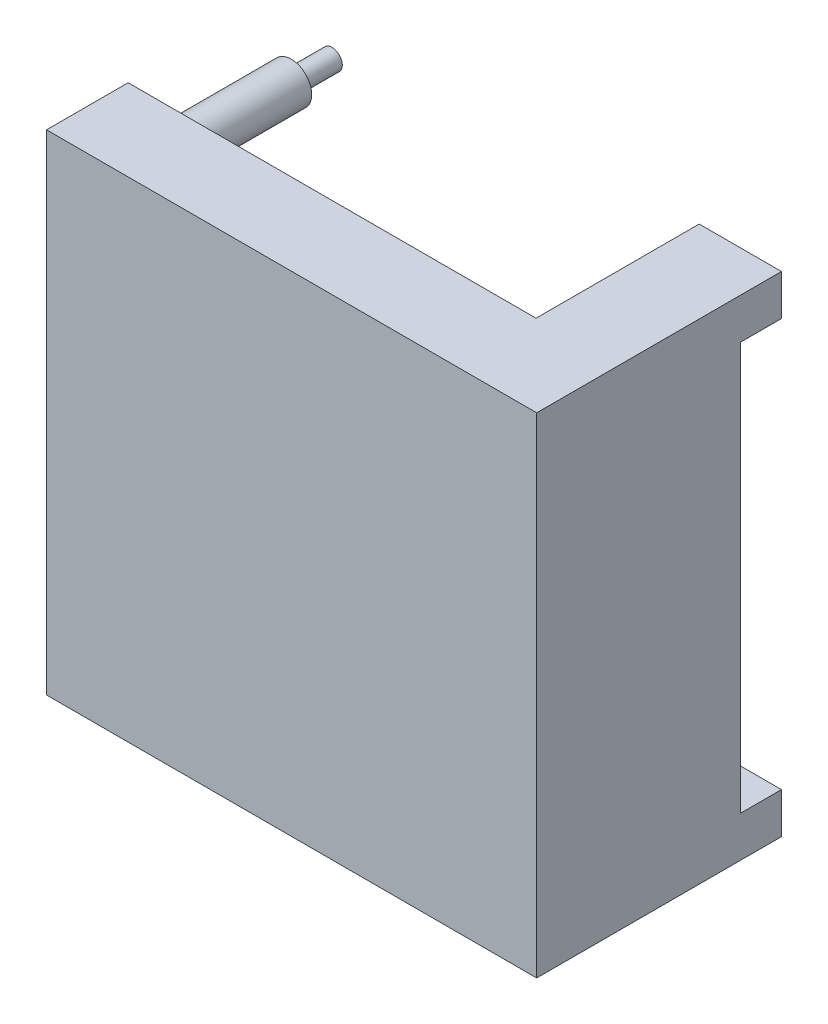
ISO-10303-21;
HEADER;
FILE_DESCRIPTION(('STEP AP214'),'2;1');
FILE_NAME('part.step','',(''),(''),'','','');
FILE_SCHEMA(('AUTOMOTIVE_DESIGN { 1 0 10303 214 1 1 1 1 }'));
ENDSEC;
DATA;
#1=APPLICATION_CONTEXT('core data for automotive mechanical design processes');
#2=APPLICATION_PROTOCOL_DEFINITION('international standard','automotive_design',2000,#1);
#3=PRODUCT_CONTEXT('',#1,'mechanical');
#4=PRODUCT('Part','Part','',(#3));
#5=PRODUCT_RELATED_PRODUCT_CATEGORY('part','',(#4));
#6=PRODUCT_DEFINITION_FORMATION('','',#4);
#7=PRODUCT_DEFINITION_CONTEXT('part definition',#1,'design');
#8=PRODUCT_DEFINITION('design','',#6,#7);
#9=PRODUCT_DEFINITION_SHAPE('','',#8);
#10=(LENGTH_UNIT() NAMED_UNIT(*) SI_UNIT(.MILLI.,.METRE.));
#11=(NAMED_UNIT(*) PLANE_ANGLE_UNIT() SI_UNIT($,.RADIAN.));
#12=(NAMED_UNIT(*) SI_UNIT($,.STERADIAN.) SOLID_ANGLE_UNIT());
#13=UNCERTAINTY_MEASURE_WITH_UNIT(LENGTH_MEASURE(1.E-05),#10,'distance_accuracy_value','');
#14=(GEOMETRIC_REPRESENTATION_CONTEXT(3) GLOBAL_UNCERTAINTY_ASSIGNED_CONTEXT((#13)) GLOBAL_UNIT_ASSIGNED_CONTEXT((#10,
#11,#12)) REPRESENTATION_CONTEXT('',''));
#15=CARTESIAN_POINT('',(0.,0.,0.));
#16=DIRECTION('',(0.,0.,1.));
#17=DIRECTION('',(1.,0.,0.));
#18=AXIS2_PLACEMENT_3D('',#15,#16,#17);
#19=CARTESIAN_POINT('',(120.162650783324,60.,-60.));
#20=DIRECTION('',(0.,0.,1.));
#21=DIRECTION('',(1.,0.,0.));
#22=AXIS2_PLACEMENT_3D('',#19,#20,#21);
#23=PLANE('',#22);
#24=DIRECTION('',(0.,-1.,0.));
#25=VECTOR('',#24,1.);
#26=CARTESIAN_POINT('',(100.,60.,-60.));
#27=LINE('',#26,#25);
#28=CARTESIAN_POINT('',(100.,-20.,-60.));
#29=VERTEX_POINT('',#28);
#30=CARTESIAN_POINT('',(100.,-30.,-60.));
#31=VERTEX_POINT('',#30);
#32=EDGE_CURVE('E209',#29,#31,#27,.T.);
#33=ORIENTED_EDGE('',*,*,#32,.F.);
#34=DIRECTION('',(-1.,0.,0.));
#35=VECTOR('',#34,1.);
#36=CARTESIAN_POINT('',(100.,-20.,-60.));
#37=LINE('',#36,#35);
#38=CARTESIAN_POINT('',(120.162650783324,-20.,-60.));
#39=VERTEX_POINT('',#38);
#40=EDGE_CURVE('E140',#39,#29,#37,.T.);
#41=ORIENTED_EDGE('',*,*,#40,.F.);
#42=DIRECTION('',(0.,-1.,0.));
#43=VECTOR('',#42,1.);
#44=CARTESIAN_POINT('',(120.162650783324,60.,-60.));
#45=LINE('',#44,#43);
#46=CARTESIAN_POINT('',(120.162650783324,-30.,-60.));
#47=VERTEX_POINT('',#46);
#48=EDGE_CURVE('E145',#39,#47,#45,.T.);
#49=ORIENTED_EDGE('',*,*,#48,.T.);
#50=DIRECTION('',(1.,0.,0.));
#51=VECTOR('',#50,1.);
#52=CARTESIAN_POINT('',(120.162650783324,-30.,-60.));
#53=LINE('',#52,#51);
#54=EDGE_CURVE('E180',#31,#47,#53,.T.);
#55=ORIENTED_EDGE('',*,*,#54,.F.);
#56=EDGE_LOOP('',(#33,#41,#49,#55));
#57=FACE_BOUND('',#56,.T.);
#58=ADVANCED_FACE('F38',(#57),#23,.F.);
#59=CARTESIAN_POINT('',(0.,60.,-20.));
#60=DIRECTION('',(1.,0.,0.));
#61=DIRECTION('',(0.,0.,-1.));
#62=AXIS2_PLACEMENT_3D('',#59,#60,#61);
#63=PLANE('',#62);
#64=DIRECTION('',(0.,-1.,0.));
#65=VECTOR('',#64,1.);
#66=CARTESIAN_POINT('',(0.,60.,-20.));
#67=LINE('',#66,#65);
#68=CARTESIAN_POINT('',(0.,90.,-20.));
#69=VERTEX_POINT('',#68);
#70=CARTESIAN_POINT('',(0.,-30.,-20.));
#71=VERTEX_POINT('',#70);
#72=EDGE_CURVE('E130',#69,#71,#67,.T.);
#73=ORIENTED_EDGE('',*,*,#72,.T.);
#74=DIRECTION('',(0.,0.,-1.));
#75=VECTOR('',#74,1.);
#76=CARTESIAN_POINT('',(0.,-30.,-20.));
#77=LINE('',#76,#75);
#78=CARTESIAN_POINT('',(0.,-30.,0.));
#79=VERTEX_POINT('',#78);
#80=EDGE_CURVE('E189',#79,#71,#77,.T.);
#81=ORIENTED_EDGE('',*,*,#80,.F.);
#82=DIRECTION('',(0.,-1.,0.));
#83=VECTOR('',#82,1.);
#84=CARTESIAN_POINT('',(0.,60.,0.));
#85=LINE('',#84,#83);
#86=CARTESIAN_POINT('',(0.,90.,0.));
#87=VERTEX_POINT('',#86);
#88=EDGE_CURVE('E216',#87,#79,#85,.T.);
#89=ORIENTED_EDGE('',*,*,#88,.F.);
#90=DIRECTION('',(0.,0.,1.));
#91=VECTOR('',#90,1.);
#92=CARTESIAN_POINT('',(0.,90.,-20.));
#93=LINE('',#92,#91);
#94=EDGE_CURVE('E195',#69,#87,#93,.T.);
#95=ORIENTED_EDGE('',*,*,#94,.F.);
#96=EDGE_LOOP('',(#73,#81,#89,#95));
#97=FACE_BOUND('',#96,.T.);
#98=ADVANCED_FACE('F40',(#97),#63,.F.);
#99=CARTESIAN_POINT('',(0.,60.,0.));
#100=DIRECTION('',(0.,0.,-1.));
#101=DIRECTION('',(-1.,0.,0.));
#102=AXIS2_PLACEMENT_3D('',#99,#100,#101);
#103=PLANE('',#102);
#104=ORIENTED_EDGE('',*,*,#88,.T.);
#105=DIRECTION('',(-1.,0.,0.));
#106=VECTOR('',#105,1.);
#107=CARTESIAN_POINT('',(0.,-30.,0.));
#108=LINE('',#107,#106);
#109=CARTESIAN_POINT('',(120.162650783324,-30.,0.));
#110=VERTEX_POINT('',#109);
#111=EDGE_CURVE('E186',#110,#79,#108,.T.);
#112=ORIENTED_EDGE('',*,*,#111,.F.);
#113=DIRECTION('',(0.,-1.,0.));
#114=VECTOR('',#113,1.);
#115=CARTESIAN_POINT('',(120.162650783324,60.,0.));
#116=LINE('',#115,#114);
#117=CARTESIAN_POINT('',(120.162650783324,90.,0.));
#118=VERTEX_POINT('',#117);
#119=EDGE_CURVE('E214',#118,#110,#116,.T.);
#120=ORIENTED_EDGE('',*,*,#119,.F.);
#121=DIRECTION('',(1.,0.,0.));
#122=VECTOR('',#121,1.);
#123=CARTESIAN_POINT('',(0.,90.,0.));
#124=LINE('',#123,#122);
#125=EDGE_CURVE('E198',#87,#118,#124,.T.);
#126=ORIENTED_EDGE('',*,*,#125,.F.);
#127=EDGE_LOOP('',(#104,#112,#120,#126));
#128=FACE_BOUND('',#127,.T.);
#129=ADVANCED_FACE('F249',(#128),#103,.F.);
#130=CARTESIAN_POINT('',(120.162650783324,60.,0.));
#131=DIRECTION('',(-1.,0.,0.));
#132=DIRECTION('',(0.,0.,1.));
#133=AXIS2_PLACEMENT_3D('',#130,#131,#132);
#134=PLANE('',#133);
#135=ORIENTED_EDGE('',*,*,#48,.F.);
#136=DIRECTION('',(0.,0.,-1.));
#137=VECTOR('',#136,1.);
#138=CARTESIAN_POINT('',(120.162650783324,-20.,-50.));
#139=LINE('',#138,#137);
#140=CARTESIAN_POINT('',(120.162650783324,-20.,-50.));
#141=VERTEX_POINT('',#140);
#142=EDGE_CURVE('E136',#141,#39,#139,.T.);
#143=ORIENTED_EDGE('',*,*,#142,.F.);
#144=DIRECTION('',(0.,-1.,0.));
#145=VECTOR('',#144,1.);
#146=CARTESIAN_POINT('',(120.162650783324,10.,-50.));
#147=LINE('',#146,#145);
#148=CARTESIAN_POINT('',(120.162650783324,80.,-50.));
#149=VERTEX_POINT('',#148);
#150=EDGE_CURVE('E120',#149,#141,#147,.T.);
#151=ORIENTED_EDGE('',*,*,#150,.F.);
#152=DIRECTION('',(0.,0.,-1.));
#153=VECTOR('',#152,1.);
#154=CARTESIAN_POINT('',(120.162650783324,80.,-50.));
#155=LINE('',#154,#153);
#156=CARTESIAN_POINT('',(120.162650783324,80.,-60.));
#157=VERTEX_POINT('',#156);
#158=EDGE_CURVE('E153',#149,#157,#155,.T.);
#159=ORIENTED_EDGE('',*,*,#158,.T.);
#160=CARTESIAN_POINT('',(120.162650783324,90.,-60.));
#161=VERTEX_POINT('',#160);
#162=EDGE_CURVE('E211',#161,#157,#45,.T.);
#163=ORIENTED_EDGE('',*,*,#162,.F.);
#164=DIRECTION('',(0.,0.,-1.));
#165=VECTOR('',#164,1.);
#166=CARTESIAN_POINT('',(120.162650783324,90.,0.));
#167=LINE('',#166,#165);
#168=EDGE_CURVE('E201',#118,#161,#167,.T.);
#169=ORIENTED_EDGE('',*,*,#168,.F.);
#170=ORIENTED_EDGE('',*,*,#119,.T.);
#171=DIRECTION('',(0.,0.,1.));
#172=VECTOR('',#171,1.);
#173=CARTESIAN_POINT('',(120.162650783324,-30.,0.));
#174=LINE('',#173,#172);
#175=EDGE_CURVE('E183',#47,#110,#174,.T.);
#176=ORIENTED_EDGE('',*,*,#175,.F.);
#177=EDGE_LOOP('',(#135,#143,#151,#159,#163,#169,#170,#176));
#178=FACE_BOUND('',#177,.T.);
#179=ADVANCED_FACE('F143',(#178),#134,.F.);
#180=ORIENTED_EDGE('',*,*,#162,.T.);
#181=DIRECTION('',(1.,0.,0.));
#182=VECTOR('',#181,1.);
#183=CARTESIAN_POINT('',(100.,80.,-60.));
#184=LINE('',#183,#182);
#185=CARTESIAN_POINT('',(100.,80.,-60.));
#186=VERTEX_POINT('',#185);
#187=EDGE_CURVE('E155',#186,#157,#184,.T.);
#188=ORIENTED_EDGE('',*,*,#187,.F.);
#189=CARTESIAN_POINT('',(100.,90.,-60.));
#190=VERTEX_POINT('',#189);
#191=EDGE_CURVE('E63',#190,#186,#27,.T.);
#192=ORIENTED_EDGE('',*,*,#191,.F.);
#193=DIRECTION('',(-1.,0.,0.));
#194=VECTOR('',#193,1.);
#195=CARTESIAN_POINT('',(120.162650783324,90.,-60.));
#196=LINE('',#195,#194);
#197=EDGE_CURVE('E204',#161,#190,#196,.T.);
#198=ORIENTED_EDGE('',*,*,#197,.F.);
#199=EDGE_LOOP('',(#180,#188,#192,#198));
#200=FACE_BOUND('',#199,.T.);
#201=ADVANCED_FACE('F246',(#200),#23,.F.);
#202=CARTESIAN_POINT('',(100.,60.,-60.));
#203=DIRECTION('',(1.,0.,0.));
#204=DIRECTION('',(0.,0.,-1.));
#205=AXIS2_PLACEMENT_3D('',#202,#203,#204);
#206=PLANE('',#205);
#207=DIRECTION('',(0.,-1.,0.));
#208=VECTOR('',#207,1.);
#209=CARTESIAN_POINT('',(100.,60.,-50.));
#210=LINE('',#209,#208);
#211=CARTESIAN_POINT('',(100.,80.,-50.));
#212=VERTEX_POINT('',#211);
#213=CARTESIAN_POINT('',(100.,-20.,-50.));
#214=VERTEX_POINT('',#213);
#215=EDGE_CURVE('E217',#212,#214,#210,.T.);
#216=ORIENTED_EDGE('',*,*,#215,.T.);
#217=DIRECTION('',(0.,0.,-1.));
#218=VECTOR('',#217,1.);
#219=CARTESIAN_POINT('',(100.,-20.,-50.));
#220=LINE('',#219,#218);
#221=EDGE_CURVE('E139',#214,#29,#220,.T.);
#222=ORIENTED_EDGE('',*,*,#221,.T.);
#223=ORIENTED_EDGE('',*,*,#32,.T.);
#224=DIRECTION('',(0.,0.,-1.));
#225=VECTOR('',#224,1.);
#226=CARTESIAN_POINT('',(100.,-30.,-60.));
#227=LINE('',#226,#225);
#228=CARTESIAN_POINT('',(100.,-30.,-20.));
#229=VERTEX_POINT('',#228);
#230=EDGE_CURVE('E177',#229,#31,#227,.T.);
#231=ORIENTED_EDGE('',*,*,#230,.F.);
#232=DIRECTION('',(0.,-1.,0.));
#233=VECTOR('',#232,1.);
#234=CARTESIAN_POINT('',(100.,60.,-20.));
#235=LINE('',#234,#233);
#236=CARTESIAN_POINT('',(100.,90.,-20.));
#237=VERTEX_POINT('',#236);
#238=EDGE_CURVE('E55',#237,#229,#235,.T.);
#239=ORIENTED_EDGE('',*,*,#238,.F.);
#240=DIRECTION('',(0.,0.,1.));
#241=VECTOR('',#240,1.);
#242=CARTESIAN_POINT('',(100.,90.,-60.));
#243=LINE('',#242,#241);
#244=EDGE_CURVE('E131',#190,#237,#243,.T.);
#245=ORIENTED_EDGE('',*,*,#244,.F.);
#246=ORIENTED_EDGE('',*,*,#191,.T.);
#247=DIRECTION('',(0.,0.,-1.));
#248=VECTOR('',#247,1.);
#249=CARTESIAN_POINT('',(100.,80.,-50.));
#250=LINE('',#249,#248);
#251=EDGE_CURVE('E151',#212,#186,#250,.T.);
#252=ORIENTED_EDGE('',*,*,#251,.F.);
#253=EDGE_LOOP('',(#216,#222,#223,#231,#239,#245,#246,#252));
#254=FACE_BOUND('',#253,.T.);
#255=ADVANCED_FACE('F227',(#254),#206,.F.);
#256=CARTESIAN_POINT('',(100.,60.,-20.));
#257=DIRECTION('',(0.,0.,1.));
#258=DIRECTION('',(1.,0.,0.));
#259=AXIS2_PLACEMENT_3D('',#256,#257,#258);
#260=PLANE('',#259);
#261=CARTESIAN_POINT('',(9.99999999999999,-20.,-20.));
#262=DIRECTION('',(0.,0.,1.));
#263=DIRECTION('',(1.,0.,0.));
#264=AXIS2_PLACEMENT_3D('',#261,#262,#263);
#265=CIRCLE('',#264,5.);
#266=CARTESIAN_POINT('',(15.,-20.,-20.));
#267=VERTEX_POINT('',#266);
#268=EDGE_CURVE('E42',#267,#267,#265,.F.);
#269=ORIENTED_EDGE('',*,*,#268,.F.);
#270=EDGE_LOOP('',(#269));
#271=FACE_BOUND('',#270,.T.);
#272=CARTESIAN_POINT('',(10.,80.,-20.));
#273=DIRECTION('',(0.,0.,1.));
#274=DIRECTION('',(1.,0.,0.));
#275=AXIS2_PLACEMENT_3D('',#272,#273,#274);
#276=CIRCLE('',#275,5.);
#277=CARTESIAN_POINT('',(15.,80.,-20.));
#278=VERTEX_POINT('',#277);
#279=EDGE_CURVE('E168',#278,#278,#276,.T.);
#280=ORIENTED_EDGE('',*,*,#279,.T.);
#281=EDGE_LOOP('',(#280));
#282=FACE_BOUND('',#281,.T.);
#283=ORIENTED_EDGE('',*,*,#238,.T.);
#284=DIRECTION('',(1.,0.,0.));
#285=VECTOR('',#284,1.);
#286=CARTESIAN_POINT('',(100.,-30.,-20.));
#287=LINE('',#286,#285);
#288=EDGE_CURVE('E172',#71,#229,#287,.T.);
#289=ORIENTED_EDGE('',*,*,#288,.F.);
#290=ORIENTED_EDGE('',*,*,#72,.F.);
#291=DIRECTION('',(-1.,0.,0.));
#292=VECTOR('',#291,1.);
#293=CARTESIAN_POINT('',(100.,90.,-20.));
#294=LINE('',#293,#292);
#295=EDGE_CURVE('E192',#237,#69,#294,.T.);
#296=ORIENTED_EDGE('',*,*,#295,.F.);
#297=EDGE_LOOP('',(#283,#289,#290,#296));
#298=FACE_BOUND('',#297,.T.);
#299=ADVANCED_FACE('F224',(#271,#282,#298),#260,.F.);
#300=CARTESIAN_POINT('',(0.,10.,-50.));
#301=DIRECTION('',(0.,0.,1.));
#302=DIRECTION('',(1.,0.,0.));
#303=AXIS2_PLACEMENT_3D('',#300,#301,#302);
#304=PLANE('',#303);
#305=ORIENTED_EDGE('',*,*,#215,.F.);
#306=DIRECTION('',(1.,0.,0.));
#307=VECTOR('',#306,1.);
#308=CARTESIAN_POINT('',(100.,80.,-50.));
#309=LINE('',#308,#307);
#310=EDGE_CURVE('E125',#212,#149,#309,.T.);
#311=ORIENTED_EDGE('',*,*,#310,.T.);
#312=ORIENTED_EDGE('',*,*,#150,.T.);
#313=DIRECTION('',(-1.,0.,0.));
#314=VECTOR('',#313,1.);
#315=CARTESIAN_POINT('',(100.,-20.,-50.));
#316=LINE('',#315,#314);
#317=EDGE_CURVE('E123',#141,#214,#316,.T.);
#318=ORIENTED_EDGE('',*,*,#317,.T.);
#319=EDGE_LOOP('',(#305,#311,#312,#318));
#320=FACE_BOUND('',#319,.T.);
#321=ADVANCED_FACE('F122',(#320),#304,.F.);
#322=CARTESIAN_POINT('',(0.,90.,0.));
#323=DIRECTION('',(0.,1.,0.));
#324=DIRECTION('',(0.,0.,1.));
#325=AXIS2_PLACEMENT_3D('',#322,#323,#324);
#326=PLANE('',#325);
#327=ORIENTED_EDGE('',*,*,#295,.T.);
#328=ORIENTED_EDGE('',*,*,#94,.T.);
#329=ORIENTED_EDGE('',*,*,#125,.T.);
#330=ORIENTED_EDGE('',*,*,#168,.T.);
#331=ORIENTED_EDGE('',*,*,#197,.T.);
#332=ORIENTED_EDGE('',*,*,#244,.T.);
#333=EDGE_LOOP('',(#327,#328,#329,#330,#331,#332));
#334=FACE_BOUND('',#333,.T.);
#335=ADVANCED_FACE('F243',(#334),#326,.T.);
#336=CARTESIAN_POINT('',(0.,-30.,0.));
#337=DIRECTION('',(0.,1.,0.));
#338=DIRECTION('',(0.,0.,1.));
#339=AXIS2_PLACEMENT_3D('',#336,#337,#338);
#340=PLANE('',#339);
#341=ORIENTED_EDGE('',*,*,#288,.T.);
#342=ORIENTED_EDGE('',*,*,#230,.T.);
#343=ORIENTED_EDGE('',*,*,#54,.T.);
#344=ORIENTED_EDGE('',*,*,#175,.T.);
#345=ORIENTED_EDGE('',*,*,#111,.T.);
#346=ORIENTED_EDGE('',*,*,#80,.T.);
#347=EDGE_LOOP('',(#341,#342,#343,#344,#345,#346));
#348=FACE_BOUND('',#347,.T.);
#349=ADVANCED_FACE('F236',(#348),#340,.F.);
#350=CARTESIAN_POINT('',(10.,80.,-50.));
#351=DIRECTION('',(0.,0.,1.));
#352=DIRECTION('',(1.,0.,0.));
#353=AXIS2_PLACEMENT_3D('',#350,#351,#352);
#354=CYLINDRICAL_SURFACE('',#353,5.);
#355=CARTESIAN_POINT('',(10.,80.,-50.));
#356=DIRECTION('',(0.,0.,1.));
#357=DIRECTION('',(1.,0.,0.));
#358=AXIS2_PLACEMENT_3D('',#355,#356,#357);
#359=CIRCLE('',#358,5.);
#360=CARTESIAN_POINT('',(15.,80.,-50.));
#361=VERTEX_POINT('',#360);
#362=EDGE_CURVE('E169',#361,#361,#359,.T.);
#363=ORIENTED_EDGE('',*,*,#362,.T.);
#364=EDGE_LOOP('',(#363));
#365=FACE_BOUND('',#364,.T.);
#366=ORIENTED_EDGE('',*,*,#279,.F.);
#367=EDGE_LOOP('',(#366));
#368=FACE_BOUND('',#367,.T.);
#369=ADVANCED_FACE('F278',(#365,#368),#354,.T.);
#370=CARTESIAN_POINT('',(10.,80.,-50.));
#371=DIRECTION('',(0.,0.,1.));
#372=DIRECTION('',(1.,0.,0.));
#373=AXIS2_PLACEMENT_3D('',#370,#371,#372);
#374=PLANE('',#373);
#375=CARTESIAN_POINT('',(10.,80.,-50.));
#376=DIRECTION('',(0.,0.,-1.));
#377=DIRECTION('',(-1.,0.,0.));
#378=AXIS2_PLACEMENT_3D('',#375,#376,#377);
#379=CIRCLE('',#378,2.5);
#380=CARTESIAN_POINT('',(7.5,80.,-50.));
#381=VERTEX_POINT('',#380);
#382=EDGE_CURVE('E11',#381,#381,#379,.T.);
#383=ORIENTED_EDGE('',*,*,#382,.F.);
#384=EDGE_LOOP('',(#383));
#385=FACE_BOUND('',#384,.T.);
#386=ORIENTED_EDGE('',*,*,#362,.F.);
#387=EDGE_LOOP('',(#386));
#388=FACE_BOUND('',#387,.T.);
#389=ADVANCED_FACE('F293',(#385,#388),#374,.F.);
#390=CARTESIAN_POINT('',(9.99999999999998,-20.,-50.));
#391=DIRECTION('',(0.,0.,1.));
#392=DIRECTION('',(1.,0.,0.));
#393=AXIS2_PLACEMENT_3D('',#390,#391,#392);
#394=CYLINDRICAL_SURFACE('',#393,5.);
#395=CARTESIAN_POINT('',(9.99999999999998,-20.,-50.));
#396=DIRECTION('',(0.,0.,-1.));
#397=DIRECTION('',(-1.,0.,0.));
#398=AXIS2_PLACEMENT_3D('',#395,#396,#397);
#399=CIRCLE('',#398,5.);
#400=CARTESIAN_POINT('',(4.99999999999998,-20.,-50.));
#401=VERTEX_POINT('',#400);
#402=EDGE_CURVE('E163',#401,#401,#399,.T.);
#403=ORIENTED_EDGE('',*,*,#402,.F.);
#404=EDGE_LOOP('',(#403));
#405=FACE_BOUND('',#404,.T.);
#406=ORIENTED_EDGE('',*,*,#268,.T.);
#407=EDGE_LOOP('',(#406));
#408=FACE_BOUND('',#407,.T.);
#409=ADVANCED_FACE('F222',(#405,#408),#394,.T.);
#410=CARTESIAN_POINT('',(9.99999999999998,-20.,-50.));
#411=DIRECTION('',(0.,0.,-1.));
#412=DIRECTION('',(-1.,0.,0.));
#413=AXIS2_PLACEMENT_3D('',#410,#411,#412);
#414=PLANE('',#413);
#415=CARTESIAN_POINT('',(9.99999999999998,-20.,-50.));
#416=DIRECTION('',(0.,0.,-1.));
#417=DIRECTION('',(-1.,0.,0.));
#418=AXIS2_PLACEMENT_3D('',#415,#416,#417);
#419=CIRCLE('',#418,2.5);
#420=CARTESIAN_POINT('',(7.49999999999998,-20.,-50.));
#421=VERTEX_POINT('',#420);
#422=EDGE_CURVE('E47',#421,#421,#419,.T.);
#423=ORIENTED_EDGE('',*,*,#422,.F.);
#424=EDGE_LOOP('',(#423));
#425=FACE_BOUND('',#424,.T.);
#426=ORIENTED_EDGE('',*,*,#402,.T.);
#427=EDGE_LOOP('',(#426));
#428=FACE_BOUND('',#427,.T.);
#429=ADVANCED_FACE('F303',(#425,#428),#414,.T.);
#430=CARTESIAN_POINT('',(9.99999999999998,-20.,-60.));
#431=DIRECTION('',(0.,0.,1.));
#432=DIRECTION('',(1.,0.,0.));
#433=AXIS2_PLACEMENT_3D('',#430,#431,#432);
#434=CYLINDRICAL_SURFACE('',#433,2.5);
#435=CARTESIAN_POINT('',(9.99999999999998,-20.,-60.));
#436=DIRECTION('',(0.,0.,-1.));
#437=DIRECTION('',(-1.,0.,0.));
#438=AXIS2_PLACEMENT_3D('',#435,#436,#437);
#439=CIRCLE('',#438,2.5);
#440=CARTESIAN_POINT('',(7.49999999999998,-20.,-60.));
#441=VERTEX_POINT('',#440);
#442=EDGE_CURVE('E160',#441,#441,#439,.T.);
#443=ORIENTED_EDGE('',*,*,#442,.F.);
#444=EDGE_LOOP('',(#443));
#445=FACE_BOUND('',#444,.T.);
#446=ORIENTED_EDGE('',*,*,#422,.T.);
#447=EDGE_LOOP('',(#446));
#448=FACE_BOUND('',#447,.T.);
#449=ADVANCED_FACE('F319',(#445,#448),#434,.T.);
#450=CARTESIAN_POINT('',(9.99999999999998,-20.,-60.));
#451=DIRECTION('',(0.,0.,-1.));
#452=DIRECTION('',(-1.,0.,0.));
#453=AXIS2_PLACEMENT_3D('',#450,#451,#452);
#454=PLANE('',#453);
#455=ORIENTED_EDGE('',*,*,#442,.T.);
#456=EDGE_LOOP('',(#455));
#457=FACE_BOUND('',#456,.T.);
#458=ADVANCED_FACE('F328',(#457),#454,.T.);
#459=CARTESIAN_POINT('',(10.,80.,-60.));
#460=DIRECTION('',(0.,0.,1.));
#461=DIRECTION('',(1.,0.,0.));
#462=AXIS2_PLACEMENT_3D('',#459,#460,#461);
#463=CYLINDRICAL_SURFACE('',#462,2.5);
#464=CARTESIAN_POINT('',(10.,80.,-60.));
#465=DIRECTION('',(0.,0.,-1.));
#466=DIRECTION('',(-1.,0.,0.));
#467=AXIS2_PLACEMENT_3D('',#464,#465,#466);
#468=CIRCLE('',#467,2.5);
#469=CARTESIAN_POINT('',(7.5,80.,-60.));
#470=VERTEX_POINT('',#469);
#471=EDGE_CURVE('E147',#470,#470,#468,.T.);
#472=ORIENTED_EDGE('',*,*,#471,.F.);
#473=EDGE_LOOP('',(#472));
#474=FACE_BOUND('',#473,.T.);
#475=ORIENTED_EDGE('',*,*,#382,.T.);
#476=EDGE_LOOP('',(#475));
#477=FACE_BOUND('',#476,.T.);
#478=ADVANCED_FACE('F337',(#474,#477),#463,.T.);
#479=CARTESIAN_POINT('',(10.,80.,-60.));
#480=DIRECTION('',(0.,0.,-1.));
#481=DIRECTION('',(-1.,0.,0.));
#482=AXIS2_PLACEMENT_3D('',#479,#480,#481);
#483=PLANE('',#482);
#484=ORIENTED_EDGE('',*,*,#471,.T.);
#485=EDGE_LOOP('',(#484));
#486=FACE_BOUND('',#485,.T.);
#487=ADVANCED_FACE('F345',(#486),#483,.T.);
#488=CARTESIAN_POINT('',(100.,80.,-50.));
#489=DIRECTION('',(0.,1.,0.));
#490=DIRECTION('',(0.,0.,1.));
#491=AXIS2_PLACEMENT_3D('',#488,#489,#490);
#492=PLANE('',#491);
#493=ORIENTED_EDGE('',*,*,#187,.T.);
#494=ORIENTED_EDGE('',*,*,#158,.F.);
#495=ORIENTED_EDGE('',*,*,#310,.F.);
#496=ORIENTED_EDGE('',*,*,#251,.T.);
#497=EDGE_LOOP('',(#493,#494,#495,#496));
#498=FACE_BOUND('',#497,.T.);
#499=ADVANCED_FACE('F245',(#498),#492,.F.);
#500=CARTESIAN_POINT('',(100.,-20.,-50.));
#501=DIRECTION('',(0.,-1.,0.));
#502=DIRECTION('',(0.,0.,-1.));
#503=AXIS2_PLACEMENT_3D('',#500,#501,#502);
#504=PLANE('',#503);
#505=ORIENTED_EDGE('',*,*,#40,.T.);
#506=ORIENTED_EDGE('',*,*,#221,.F.);
#507=ORIENTED_EDGE('',*,*,#317,.F.);
#508=ORIENTED_EDGE('',*,*,#142,.T.);
#509=EDGE_LOOP('',(#505,#506,#507,#508));
#510=FACE_BOUND('',#509,.T.);
#511=ADVANCED_FACE('F135',(#510),#504,.F.);
#512=CLOSED_SHELL('',(#58,#98,#129,#179,#201,#255,#299,#321,#335,#349,#369,#389,#409,#429,#449,
#458,#478,#487,#499,#511));
#513=MANIFOLD_SOLID_BREP('B2',#512);
#514=ADVANCED_BREP_SHAPE_REPRESENTATION('',(#18,#513),#14);
#515=SHAPE_DEFINITION_REPRESENTATION(#9,#514);
ENDSEC;
END-ISO-10303-21;
